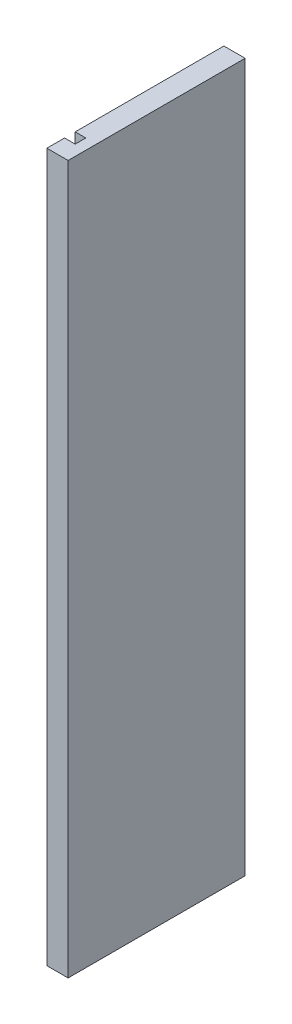
ISO-10303-21;
HEADER;
FILE_DESCRIPTION(('STEP AP214'),'2;1');
FILE_NAME('part.step','',(''),(''),'','','');
FILE_SCHEMA(('AUTOMOTIVE_DESIGN { 1 0 10303 214 1 1 1 1 }'));
ENDSEC;
DATA;
#1=APPLICATION_CONTEXT('core data for automotive mechanical design processes');
#2=APPLICATION_PROTOCOL_DEFINITION('international standard','automotive_design',2000,#1);
#3=PRODUCT_CONTEXT('',#1,'mechanical');
#4=PRODUCT('Part','Part','',(#3));
#5=PRODUCT_RELATED_PRODUCT_CATEGORY('part','',(#4));
#6=PRODUCT_DEFINITION_FORMATION('','',#4);
#7=PRODUCT_DEFINITION_CONTEXT('part definition',#1,'design');
#8=PRODUCT_DEFINITION('design','',#6,#7);
#9=PRODUCT_DEFINITION_SHAPE('','',#8);
#10=(LENGTH_UNIT() NAMED_UNIT(*) SI_UNIT(.MILLI.,.METRE.));
#11=(NAMED_UNIT(*) PLANE_ANGLE_UNIT() SI_UNIT($,.RADIAN.));
#12=(NAMED_UNIT(*) SI_UNIT($,.STERADIAN.) SOLID_ANGLE_UNIT());
#13=UNCERTAINTY_MEASURE_WITH_UNIT(LENGTH_MEASURE(1.E-05),#10,'distance_accuracy_value','');
#14=(GEOMETRIC_REPRESENTATION_CONTEXT(3) GLOBAL_UNCERTAINTY_ASSIGNED_CONTEXT((#13)) GLOBAL_UNIT_ASSIGNED_CONTEXT((#10,
#11,#12)) REPRESENTATION_CONTEXT('',''));
#15=CARTESIAN_POINT('',(0.,0.,0.));
#16=DIRECTION('',(0.,0.,1.));
#17=DIRECTION('',(1.,0.,0.));
#18=AXIS2_PLACEMENT_3D('',#15,#16,#17);
#19=CARTESIAN_POINT('',(0.,400.,-24.2447689501648));
#20=DIRECTION('',(0.,0.,1.));
#21=DIRECTION('',(1.,0.,0.));
#22=AXIS2_PLACEMENT_3D('',#19,#20,#21);
#23=PLANE('',#22);
#24=DIRECTION('',(-1.,0.,0.));
#25=VECTOR('',#24,1.);
#26=CARTESIAN_POINT('',(0.,0.,-24.2447689501648));
#27=LINE('',#26,#25);
#28=CARTESIAN_POINT('',(12.,0.,-24.2447689501648));
#29=VERTEX_POINT('',#28);
#30=CARTESIAN_POINT('',(0.,0.,-24.2447689501648));
#31=VERTEX_POINT('',#30);
#32=EDGE_CURVE('E129',#29,#31,#27,.T.);
#33=ORIENTED_EDGE('',*,*,#32,.T.);
#34=DIRECTION('',(0.,-1.,0.));
#35=VECTOR('',#34,1.);
#36=CARTESIAN_POINT('',(0.,400.,-24.2447689501648));
#37=LINE('',#36,#35);
#38=CARTESIAN_POINT('',(0.,400.,-24.2447689501648));
#39=VERTEX_POINT('',#38);
#40=EDGE_CURVE('E11',#39,#31,#37,.T.);
#41=ORIENTED_EDGE('',*,*,#40,.F.);
#42=DIRECTION('',(-1.,0.,0.));
#43=VECTOR('',#42,1.);
#44=CARTESIAN_POINT('',(0.,400.,-24.2447689501648));
#45=LINE('',#44,#43);
#46=CARTESIAN_POINT('',(12.,400.,-24.2447689501648));
#47=VERTEX_POINT('',#46);
#48=EDGE_CURVE('E143',#47,#39,#45,.T.);
#49=ORIENTED_EDGE('',*,*,#48,.F.);
#50=DIRECTION('',(0.,-1.,0.));
#51=VECTOR('',#50,1.);
#52=CARTESIAN_POINT('',(12.,400.,-24.2447689501648));
#53=LINE('',#52,#51);
#54=EDGE_CURVE('E125',#47,#29,#53,.T.);
#55=ORIENTED_EDGE('',*,*,#54,.T.);
#56=EDGE_LOOP('',(#33,#41,#49,#55));
#57=FACE_BOUND('',#56,.T.);
#58=ADVANCED_FACE('F33',(#57),#23,.F.);
#59=CARTESIAN_POINT('',(0.,400.,59.7552310498352));
#60=DIRECTION('',(1.,0.,0.));
#61=DIRECTION('',(0.,0.,-1.));
#62=AXIS2_PLACEMENT_3D('',#59,#60,#61);
#63=PLANE('',#62);
#64=DIRECTION('',(0.,0.,1.));
#65=VECTOR('',#64,1.);
#66=CARTESIAN_POINT('',(0.,0.,59.7552310498352));
#67=LINE('',#66,#65);
#68=CARTESIAN_POINT('',(0.,0.,59.7552310498352));
#69=VERTEX_POINT('',#68);
#70=EDGE_CURVE('E132',#31,#69,#67,.T.);
#71=ORIENTED_EDGE('',*,*,#70,.T.);
#72=DIRECTION('',(0.,-1.,0.));
#73=VECTOR('',#72,1.);
#74=CARTESIAN_POINT('',(0.,400.,59.7552310498352));
#75=LINE('',#74,#73);
#76=CARTESIAN_POINT('',(0.,400.,59.7552310498352));
#77=VERTEX_POINT('',#76);
#78=EDGE_CURVE('E41',#77,#69,#75,.T.);
#79=ORIENTED_EDGE('',*,*,#78,.F.);
#80=DIRECTION('',(0.,0.,1.));
#81=VECTOR('',#80,1.);
#82=CARTESIAN_POINT('',(0.,400.,59.7552310498352));
#83=LINE('',#82,#81);
#84=EDGE_CURVE('E92',#39,#77,#83,.T.);
#85=ORIENTED_EDGE('',*,*,#84,.F.);
#86=ORIENTED_EDGE('',*,*,#40,.T.);
#87=EDGE_LOOP('',(#71,#79,#85,#86));
#88=FACE_BOUND('',#87,.T.);
#89=ADVANCED_FACE('F178',(#88),#63,.F.);
#90=CARTESIAN_POINT('',(6.,400.,59.7552310498352));
#91=DIRECTION('',(0.,0.,-1.));
#92=DIRECTION('',(-1.,0.,0.));
#93=AXIS2_PLACEMENT_3D('',#90,#91,#92);
#94=PLANE('',#93);
#95=DIRECTION('',(1.,0.,0.));
#96=VECTOR('',#95,1.);
#97=CARTESIAN_POINT('',(6.,0.,59.7552310498352));
#98=LINE('',#97,#96);
#99=CARTESIAN_POINT('',(6.,0.,59.7552310498352));
#100=VERTEX_POINT('',#99);
#101=EDGE_CURVE('E134',#69,#100,#98,.T.);
#102=ORIENTED_EDGE('',*,*,#101,.T.);
#103=DIRECTION('',(0.,-1.,0.));
#104=VECTOR('',#103,1.);
#105=CARTESIAN_POINT('',(6.,400.,59.7552310498352));
#106=LINE('',#105,#104);
#107=CARTESIAN_POINT('',(6.,400.,59.7552310498352));
#108=VERTEX_POINT('',#107);
#109=EDGE_CURVE('E150',#108,#100,#106,.T.);
#110=ORIENTED_EDGE('',*,*,#109,.F.);
#111=DIRECTION('',(1.,0.,0.));
#112=VECTOR('',#111,1.);
#113=CARTESIAN_POINT('',(6.,400.,59.7552310498352));
#114=LINE('',#113,#112);
#115=EDGE_CURVE('E158',#77,#108,#114,.T.);
#116=ORIENTED_EDGE('',*,*,#115,.F.);
#117=ORIENTED_EDGE('',*,*,#78,.T.);
#118=EDGE_LOOP('',(#102,#110,#116,#117));
#119=FACE_BOUND('',#118,.T.);
#120=ADVANCED_FACE('F156',(#119),#94,.F.);
#121=CARTESIAN_POINT('',(6.,400.,65.7552310498352));
#122=DIRECTION('',(1.,0.,0.));
#123=DIRECTION('',(0.,0.,-1.));
#124=AXIS2_PLACEMENT_3D('',#121,#122,#123);
#125=PLANE('',#124);
#126=DIRECTION('',(0.,0.,1.));
#127=VECTOR('',#126,1.);
#128=CARTESIAN_POINT('',(6.,0.,65.7552310498352));
#129=LINE('',#128,#127);
#130=CARTESIAN_POINT('',(6.,0.,65.7552310498352));
#131=VERTEX_POINT('',#130);
#132=EDGE_CURVE('E136',#100,#131,#129,.T.);
#133=ORIENTED_EDGE('',*,*,#132,.T.);
#134=DIRECTION('',(0.,-1.,0.));
#135=VECTOR('',#134,1.);
#136=CARTESIAN_POINT('',(6.,400.,65.7552310498352));
#137=LINE('',#136,#135);
#138=CARTESIAN_POINT('',(6.,400.,65.7552310498352));
#139=VERTEX_POINT('',#138);
#140=EDGE_CURVE('E147',#139,#131,#137,.T.);
#141=ORIENTED_EDGE('',*,*,#140,.F.);
#142=DIRECTION('',(0.,0.,1.));
#143=VECTOR('',#142,1.);
#144=CARTESIAN_POINT('',(6.,400.,65.7552310498352));
#145=LINE('',#144,#143);
#146=EDGE_CURVE('E170',#108,#139,#145,.T.);
#147=ORIENTED_EDGE('',*,*,#146,.F.);
#148=ORIENTED_EDGE('',*,*,#109,.T.);
#149=EDGE_LOOP('',(#133,#141,#147,#148));
#150=FACE_BOUND('',#149,.T.);
#151=ADVANCED_FACE('F166',(#150),#125,.F.);
#152=CARTESIAN_POINT('',(0.,400.,65.7552310498352));
#153=DIRECTION('',(0.,0.,1.));
#154=DIRECTION('',(1.,0.,0.));
#155=AXIS2_PLACEMENT_3D('',#152,#153,#154);
#156=PLANE('',#155);
#157=DIRECTION('',(-1.,0.,0.));
#158=VECTOR('',#157,1.);
#159=CARTESIAN_POINT('',(0.,0.,65.7552310498352));
#160=LINE('',#159,#158);
#161=CARTESIAN_POINT('',(0.,0.,65.7552310498352));
#162=VERTEX_POINT('',#161);
#163=EDGE_CURVE('E138',#131,#162,#160,.T.);
#164=ORIENTED_EDGE('',*,*,#163,.T.);
#165=DIRECTION('',(0.,-1.,0.));
#166=VECTOR('',#165,1.);
#167=CARTESIAN_POINT('',(0.,400.,65.7552310498352));
#168=LINE('',#167,#166);
#169=CARTESIAN_POINT('',(0.,400.,65.7552310498352));
#170=VERTEX_POINT('',#169);
#171=EDGE_CURVE('E120',#170,#162,#168,.T.);
#172=ORIENTED_EDGE('',*,*,#171,.F.);
#173=DIRECTION('',(-1.,0.,0.));
#174=VECTOR('',#173,1.);
#175=CARTESIAN_POINT('',(0.,400.,65.7552310498352));
#176=LINE('',#175,#174);
#177=EDGE_CURVE('E111',#139,#170,#176,.T.);
#178=ORIENTED_EDGE('',*,*,#177,.F.);
#179=ORIENTED_EDGE('',*,*,#140,.T.);
#180=EDGE_LOOP('',(#164,#172,#178,#179));
#181=FACE_BOUND('',#180,.T.);
#182=ADVANCED_FACE('F169',(#181),#156,.F.);
#183=CARTESIAN_POINT('',(0.,400.,75.7552310498352));
#184=DIRECTION('',(1.,0.,0.));
#185=DIRECTION('',(0.,0.,-1.));
#186=AXIS2_PLACEMENT_3D('',#183,#184,#185);
#187=PLANE('',#186);
#188=DIRECTION('',(0.,0.,1.));
#189=VECTOR('',#188,1.);
#190=CARTESIAN_POINT('',(0.,0.,75.7552310498352));
#191=LINE('',#190,#189);
#192=CARTESIAN_POINT('',(0.,0.,75.7552310498352));
#193=VERTEX_POINT('',#192);
#194=EDGE_CURVE('E119',#162,#193,#191,.T.);
#195=ORIENTED_EDGE('',*,*,#194,.T.);
#196=DIRECTION('',(0.,-1.,0.));
#197=VECTOR('',#196,1.);
#198=CARTESIAN_POINT('',(0.,400.,75.7552310498352));
#199=LINE('',#198,#197);
#200=CARTESIAN_POINT('',(0.,400.,75.7552310498352));
#201=VERTEX_POINT('',#200);
#202=EDGE_CURVE('E116',#201,#193,#199,.T.);
#203=ORIENTED_EDGE('',*,*,#202,.F.);
#204=DIRECTION('',(0.,0.,1.));
#205=VECTOR('',#204,1.);
#206=CARTESIAN_POINT('',(0.,400.,75.7552310498352));
#207=LINE('',#206,#205);
#208=EDGE_CURVE('E105',#170,#201,#207,.T.);
#209=ORIENTED_EDGE('',*,*,#208,.F.);
#210=ORIENTED_EDGE('',*,*,#171,.T.);
#211=EDGE_LOOP('',(#195,#203,#209,#210));
#212=FACE_BOUND('',#211,.T.);
#213=ADVANCED_FACE('F117',(#212),#187,.F.);
#214=CARTESIAN_POINT('',(12.,400.,75.7552310498352));
#215=DIRECTION('',(0.,0.,-1.));
#216=DIRECTION('',(-1.,0.,0.));
#217=AXIS2_PLACEMENT_3D('',#214,#215,#216);
#218=PLANE('',#217);
#219=DIRECTION('',(1.,0.,0.));
#220=VECTOR('',#219,1.);
#221=CARTESIAN_POINT('',(12.,0.,75.7552310498352));
#222=LINE('',#221,#220);
#223=CARTESIAN_POINT('',(12.,0.,75.7552310498352));
#224=VERTEX_POINT('',#223);
#225=EDGE_CURVE('E78',#193,#224,#222,.T.);
#226=ORIENTED_EDGE('',*,*,#225,.T.);
#227=DIRECTION('',(0.,-1.,0.));
#228=VECTOR('',#227,1.);
#229=CARTESIAN_POINT('',(12.,400.,75.7552310498352));
#230=LINE('',#229,#228);
#231=CARTESIAN_POINT('',(12.,400.,75.7552310498352));
#232=VERTEX_POINT('',#231);
#233=EDGE_CURVE('E121',#232,#224,#230,.T.);
#234=ORIENTED_EDGE('',*,*,#233,.F.);
#235=DIRECTION('',(1.,0.,0.));
#236=VECTOR('',#235,1.);
#237=CARTESIAN_POINT('',(12.,400.,75.7552310498352));
#238=LINE('',#237,#236);
#239=EDGE_CURVE('E109',#201,#232,#238,.T.);
#240=ORIENTED_EDGE('',*,*,#239,.F.);
#241=ORIENTED_EDGE('',*,*,#202,.T.);
#242=EDGE_LOOP('',(#226,#234,#240,#241));
#243=FACE_BOUND('',#242,.T.);
#244=ADVANCED_FACE('F123',(#243),#218,.F.);
#245=CARTESIAN_POINT('',(12.,400.,-24.2447689501648));
#246=DIRECTION('',(-1.,0.,0.));
#247=DIRECTION('',(0.,0.,1.));
#248=AXIS2_PLACEMENT_3D('',#245,#246,#247);
#249=PLANE('',#248);
#250=DIRECTION('',(0.,0.,-1.));
#251=VECTOR('',#250,1.);
#252=CARTESIAN_POINT('',(12.,0.,-24.2447689501648));
#253=LINE('',#252,#251);
#254=EDGE_CURVE('E84',#224,#29,#253,.T.);
#255=ORIENTED_EDGE('',*,*,#254,.T.);
#256=ORIENTED_EDGE('',*,*,#54,.F.);
#257=DIRECTION('',(0.,0.,-1.));
#258=VECTOR('',#257,1.);
#259=CARTESIAN_POINT('',(12.,400.,-24.2447689501648));
#260=LINE('',#259,#258);
#261=EDGE_CURVE('E49',#232,#47,#260,.T.);
#262=ORIENTED_EDGE('',*,*,#261,.F.);
#263=ORIENTED_EDGE('',*,*,#233,.T.);
#264=EDGE_LOOP('',(#255,#256,#262,#263));
#265=FACE_BOUND('',#264,.T.);
#266=ADVANCED_FACE('F194',(#265),#249,.F.);
#267=CARTESIAN_POINT('',(0.,400.,0.));
#268=DIRECTION('',(0.,-1.,0.));
#269=DIRECTION('',(0.,0.,-1.));
#270=AXIS2_PLACEMENT_3D('',#267,#268,#269);
#271=PLANE('',#270);
#272=ORIENTED_EDGE('',*,*,#48,.T.);
#273=ORIENTED_EDGE('',*,*,#84,.T.);
#274=ORIENTED_EDGE('',*,*,#115,.T.);
#275=ORIENTED_EDGE('',*,*,#146,.T.);
#276=ORIENTED_EDGE('',*,*,#177,.T.);
#277=ORIENTED_EDGE('',*,*,#208,.T.);
#278=ORIENTED_EDGE('',*,*,#239,.T.);
#279=ORIENTED_EDGE('',*,*,#261,.T.);
#280=EDGE_LOOP('',(#272,#273,#274,#275,#276,#277,#278,#279));
#281=FACE_BOUND('',#280,.T.);
#282=ADVANCED_FACE('F107',(#281),#271,.F.);
#283=CARTESIAN_POINT('',(0.,0.,0.));
#284=DIRECTION('',(0.,-1.,0.));
#285=DIRECTION('',(0.,0.,-1.));
#286=AXIS2_PLACEMENT_3D('',#283,#284,#285);
#287=PLANE('',#286);
#288=ORIENTED_EDGE('',*,*,#32,.F.);
#289=ORIENTED_EDGE('',*,*,#254,.F.);
#290=ORIENTED_EDGE('',*,*,#225,.F.);
#291=ORIENTED_EDGE('',*,*,#194,.F.);
#292=ORIENTED_EDGE('',*,*,#163,.F.);
#293=ORIENTED_EDGE('',*,*,#132,.F.);
#294=ORIENTED_EDGE('',*,*,#101,.F.);
#295=ORIENTED_EDGE('',*,*,#70,.F.);
#296=EDGE_LOOP('',(#288,#289,#290,#291,#292,#293,#294,#295));
#297=FACE_BOUND('',#296,.T.);
#298=ADVANCED_FACE('F162',(#297),#287,.T.);
#299=CLOSED_SHELL('',(#58,#89,#120,#151,#182,#213,#244,#266,#282,#298));
#300=MANIFOLD_SOLID_BREP('B2',#299);
#301=ADVANCED_BREP_SHAPE_REPRESENTATION('',(#18,#300),#14);
#302=SHAPE_DEFINITION_REPRESENTATION(#9,#301);
ENDSEC;
END-ISO-10303-21;
